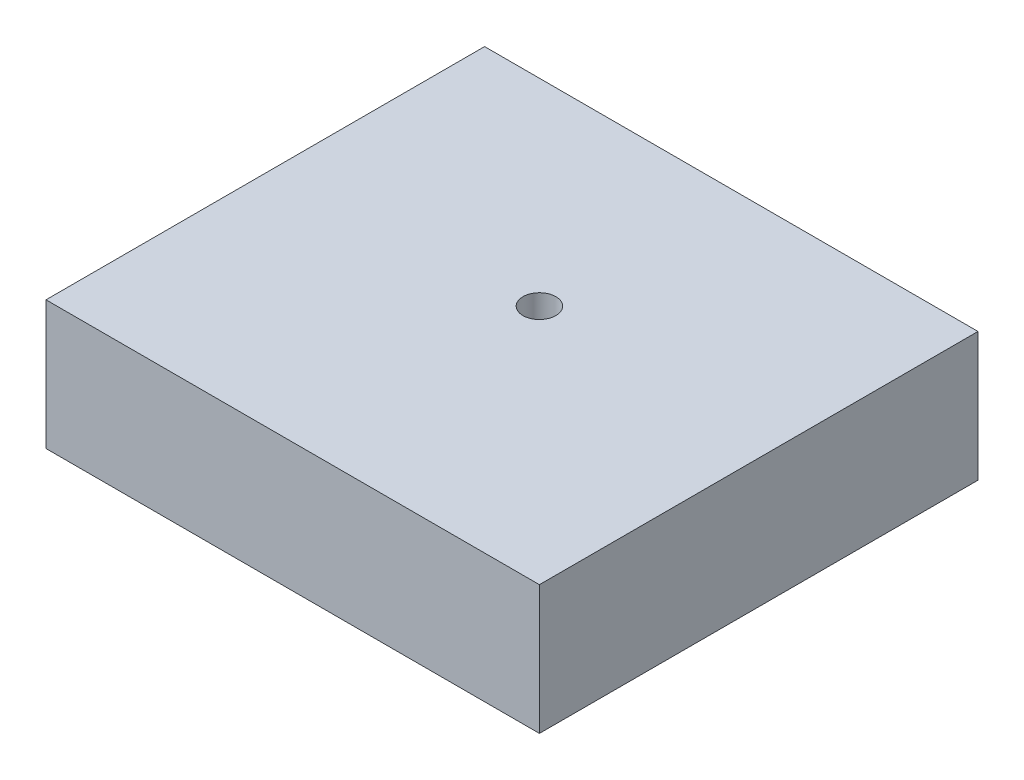
ISO-10303-21;
HEADER;
FILE_DESCRIPTION(('STEP AP214'),'2;1');
FILE_NAME('part.step','',(''),(''),'','','');
FILE_SCHEMA(('AUTOMOTIVE_DESIGN { 1 0 10303 214 1 1 1 1 }'));
ENDSEC;
DATA;
#1=APPLICATION_CONTEXT('core data for automotive mechanical design processes');
#2=APPLICATION_PROTOCOL_DEFINITION('international standard','automotive_design',2000,#1);
#3=PRODUCT_CONTEXT('',#1,'mechanical');
#4=PRODUCT('Part','Part','',(#3));
#5=PRODUCT_RELATED_PRODUCT_CATEGORY('part','',(#4));
#6=PRODUCT_DEFINITION_FORMATION('','',#4);
#7=PRODUCT_DEFINITION_CONTEXT('part definition',#1,'design');
#8=PRODUCT_DEFINITION('design','',#6,#7);
#9=PRODUCT_DEFINITION_SHAPE('','',#8);
#10=(LENGTH_UNIT() NAMED_UNIT(*) SI_UNIT(.MILLI.,.METRE.));
#11=(NAMED_UNIT(*) PLANE_ANGLE_UNIT() SI_UNIT($,.RADIAN.));
#12=(NAMED_UNIT(*) SI_UNIT($,.STERADIAN.) SOLID_ANGLE_UNIT());
#13=UNCERTAINTY_MEASURE_WITH_UNIT(LENGTH_MEASURE(1.E-05),#10,'distance_accuracy_value','');
#14=(GEOMETRIC_REPRESENTATION_CONTEXT(3) GLOBAL_UNCERTAINTY_ASSIGNED_CONTEXT((#13)) GLOBAL_UNIT_ASSIGNED_CONTEXT((#10,
#11,#12)) REPRESENTATION_CONTEXT('',''));
#15=CARTESIAN_POINT('',(0.,0.,0.));
#16=DIRECTION('',(0.,0.,1.));
#17=DIRECTION('',(1.,0.,0.));
#18=AXIS2_PLACEMENT_3D('',#15,#16,#17);
#19=CARTESIAN_POINT('',(0.,4.7,0.));
#20=DIRECTION('',(0.,-1.,0.));
#21=DIRECTION('',(0.,0.,-1.));
#22=AXIS2_PLACEMENT_3D('',#19,#20,#21);
#23=PLANE('',#22);
#24=DIRECTION('',(0.,0.,1.));
#25=VECTOR('',#24,1.);
#26=CARTESIAN_POINT('',(0.,4.7,0.));
#27=LINE('',#26,#25);
#28=CARTESIAN_POINT('',(0.,4.7,-16.));
#29=VERTEX_POINT('',#28);
#30=CARTESIAN_POINT('',(0.,4.7,0.));
#31=VERTEX_POINT('',#30);
#32=EDGE_CURVE('E85',#29,#31,#27,.T.);
#33=ORIENTED_EDGE('',*,*,#32,.T.);
#34=DIRECTION('',(1.,0.,0.));
#35=VECTOR('',#34,1.);
#36=CARTESIAN_POINT('',(0.,4.7,0.));
#37=LINE('',#36,#35);
#38=CARTESIAN_POINT('',(18.,4.7,0.));
#39=VERTEX_POINT('',#38);
#40=EDGE_CURVE('E80',#31,#39,#37,.T.);
#41=ORIENTED_EDGE('',*,*,#40,.T.);
#42=DIRECTION('',(0.,0.,-1.));
#43=VECTOR('',#42,1.);
#44=CARTESIAN_POINT('',(18.,4.7,0.));
#45=LINE('',#44,#43);
#46=CARTESIAN_POINT('',(18.,4.7,-16.));
#47=VERTEX_POINT('',#46);
#48=EDGE_CURVE('E83',#39,#47,#45,.T.);
#49=ORIENTED_EDGE('',*,*,#48,.T.);
#50=DIRECTION('',(-1.,0.,0.));
#51=VECTOR('',#50,1.);
#52=CARTESIAN_POINT('',(0.,4.7,-16.));
#53=LINE('',#52,#51);
#54=EDGE_CURVE('E50',#47,#29,#53,.T.);
#55=ORIENTED_EDGE('',*,*,#54,.T.);
#56=EDGE_LOOP('',(#33,#41,#49,#55));
#57=FACE_BOUND('',#56,.T.);
#58=CARTESIAN_POINT('',(9.2,4.7,-8.8));
#59=DIRECTION('',(0.,1.,0.));
#60=DIRECTION('',(0.,0.,1.));
#61=AXIS2_PLACEMENT_3D('',#58,#59,#60);
#62=CIRCLE('',#61,0.6);
#63=CARTESIAN_POINT('',(9.2,4.7,-8.2));
#64=VERTEX_POINT('',#63);
#65=EDGE_CURVE('E100',#64,#64,#62,.T.);
#66=ORIENTED_EDGE('',*,*,#65,.F.);
#67=EDGE_LOOP('',(#66));
#68=FACE_BOUND('',#67,.T.);
#69=ADVANCED_FACE('F33',(#57,#68),#23,.F.);
#70=CARTESIAN_POINT('',(0.,0.,0.));
#71=DIRECTION('',(0.,-1.,0.));
#72=DIRECTION('',(0.,0.,-1.));
#73=AXIS2_PLACEMENT_3D('',#70,#71,#72);
#74=PLANE('',#73);
#75=DIRECTION('',(0.,0.,1.));
#76=VECTOR('',#75,1.);
#77=CARTESIAN_POINT('',(0.,0.,0.));
#78=LINE('',#77,#76);
#79=CARTESIAN_POINT('',(0.,0.,-16.));
#80=VERTEX_POINT('',#79);
#81=CARTESIAN_POINT('',(0.,0.,0.));
#82=VERTEX_POINT('',#81);
#83=EDGE_CURVE('E97',#80,#82,#78,.T.);
#84=ORIENTED_EDGE('',*,*,#83,.F.);
#85=DIRECTION('',(-1.,0.,0.));
#86=VECTOR('',#85,1.);
#87=CARTESIAN_POINT('',(0.,0.,-16.));
#88=LINE('',#87,#86);
#89=CARTESIAN_POINT('',(18.,0.,-16.));
#90=VERTEX_POINT('',#89);
#91=EDGE_CURVE('E73',#90,#80,#88,.T.);
#92=ORIENTED_EDGE('',*,*,#91,.F.);
#93=DIRECTION('',(0.,0.,-1.));
#94=VECTOR('',#93,1.);
#95=CARTESIAN_POINT('',(18.,0.,0.));
#96=LINE('',#95,#94);
#97=CARTESIAN_POINT('',(18.,0.,0.));
#98=VERTEX_POINT('',#97);
#99=EDGE_CURVE('E67',#98,#90,#96,.T.);
#100=ORIENTED_EDGE('',*,*,#99,.F.);
#101=DIRECTION('',(1.,0.,0.));
#102=VECTOR('',#101,1.);
#103=CARTESIAN_POINT('',(0.,0.,0.));
#104=LINE('',#103,#102);
#105=EDGE_CURVE('E89',#82,#98,#104,.T.);
#106=ORIENTED_EDGE('',*,*,#105,.F.);
#107=EDGE_LOOP('',(#84,#92,#100,#106));
#108=FACE_BOUND('',#107,.T.);
#109=CARTESIAN_POINT('',(9.2,0.,-8.8));
#110=DIRECTION('',(0.,1.,0.));
#111=DIRECTION('',(0.,0.,1.));
#112=AXIS2_PLACEMENT_3D('',#109,#110,#111);
#113=CIRCLE('',#112,0.6);
#114=CARTESIAN_POINT('',(9.2,0.,-8.2));
#115=VERTEX_POINT('',#114);
#116=EDGE_CURVE('E112',#115,#115,#113,.T.);
#117=ORIENTED_EDGE('',*,*,#116,.T.);
#118=EDGE_LOOP('',(#117));
#119=FACE_BOUND('',#118,.T.);
#120=ADVANCED_FACE('F108',(#108,#119),#74,.T.);
#121=CARTESIAN_POINT('',(0.,4.7,0.));
#122=DIRECTION('',(1.,0.,0.));
#123=DIRECTION('',(0.,0.,-1.));
#124=AXIS2_PLACEMENT_3D('',#121,#122,#123);
#125=PLANE('',#124);
#126=ORIENTED_EDGE('',*,*,#83,.T.);
#127=DIRECTION('',(0.,-1.,0.));
#128=VECTOR('',#127,1.);
#129=CARTESIAN_POINT('',(0.,4.7,0.));
#130=LINE('',#129,#128);
#131=EDGE_CURVE('E11',#31,#82,#130,.T.);
#132=ORIENTED_EDGE('',*,*,#131,.F.);
#133=ORIENTED_EDGE('',*,*,#32,.F.);
#134=DIRECTION('',(0.,-1.,0.));
#135=VECTOR('',#134,1.);
#136=CARTESIAN_POINT('',(0.,4.7,-16.));
#137=LINE('',#136,#135);
#138=EDGE_CURVE('E93',#29,#80,#137,.T.);
#139=ORIENTED_EDGE('',*,*,#138,.T.);
#140=EDGE_LOOP('',(#126,#132,#133,#139));
#141=FACE_BOUND('',#140,.T.);
#142=ADVANCED_FACE('F35',(#141),#125,.F.);
#143=CARTESIAN_POINT('',(0.,4.7,0.));
#144=DIRECTION('',(0.,0.,-1.));
#145=DIRECTION('',(-1.,0.,0.));
#146=AXIS2_PLACEMENT_3D('',#143,#144,#145);
#147=PLANE('',#146);
#148=ORIENTED_EDGE('',*,*,#105,.T.);
#149=DIRECTION('',(0.,-1.,0.));
#150=VECTOR('',#149,1.);
#151=CARTESIAN_POINT('',(18.,4.7,0.));
#152=LINE('',#151,#150);
#153=EDGE_CURVE('E42',#39,#98,#152,.T.);
#154=ORIENTED_EDGE('',*,*,#153,.F.);
#155=ORIENTED_EDGE('',*,*,#40,.F.);
#156=ORIENTED_EDGE('',*,*,#131,.T.);
#157=EDGE_LOOP('',(#148,#154,#155,#156));
#158=FACE_BOUND('',#157,.T.);
#159=ADVANCED_FACE('F88',(#158),#147,.F.);
#160=CARTESIAN_POINT('',(18.,4.7,0.));
#161=DIRECTION('',(-1.,0.,0.));
#162=DIRECTION('',(0.,0.,1.));
#163=AXIS2_PLACEMENT_3D('',#160,#161,#162);
#164=PLANE('',#163);
#165=ORIENTED_EDGE('',*,*,#99,.T.);
#166=DIRECTION('',(0.,-1.,0.));
#167=VECTOR('',#166,1.);
#168=CARTESIAN_POINT('',(18.,4.7,-16.));
#169=LINE('',#168,#167);
#170=EDGE_CURVE('E90',#47,#90,#169,.T.);
#171=ORIENTED_EDGE('',*,*,#170,.F.);
#172=ORIENTED_EDGE('',*,*,#48,.F.);
#173=ORIENTED_EDGE('',*,*,#153,.T.);
#174=EDGE_LOOP('',(#165,#171,#172,#173));
#175=FACE_BOUND('',#174,.T.);
#176=ADVANCED_FACE('F91',(#175),#164,.F.);
#177=CARTESIAN_POINT('',(0.,4.7,-16.));
#178=DIRECTION('',(0.,0.,1.));
#179=DIRECTION('',(1.,0.,0.));
#180=AXIS2_PLACEMENT_3D('',#177,#178,#179);
#181=PLANE('',#180);
#182=ORIENTED_EDGE('',*,*,#91,.T.);
#183=ORIENTED_EDGE('',*,*,#138,.F.);
#184=ORIENTED_EDGE('',*,*,#54,.F.);
#185=ORIENTED_EDGE('',*,*,#170,.T.);
#186=EDGE_LOOP('',(#182,#183,#184,#185));
#187=FACE_BOUND('',#186,.T.);
#188=ADVANCED_FACE('F105',(#187),#181,.F.);
#189=CARTESIAN_POINT('',(9.2,4.7,-8.8));
#190=DIRECTION('',(0.,-1.,0.));
#191=DIRECTION('',(0.,0.,-1.));
#192=AXIS2_PLACEMENT_3D('',#189,#190,#191);
#193=CYLINDRICAL_SURFACE('',#192,0.6);
#194=ORIENTED_EDGE('',*,*,#65,.T.);
#195=EDGE_LOOP('',(#194));
#196=FACE_BOUND('',#195,.T.);
#197=ORIENTED_EDGE('',*,*,#116,.F.);
#198=EDGE_LOOP('',(#197));
#199=FACE_BOUND('',#198,.T.);
#200=ADVANCED_FACE('F118',(#196,#199),#193,.F.);
#201=CLOSED_SHELL('',(#69,#120,#142,#159,#176,#188,#200));
#202=MANIFOLD_SOLID_BREP('B2',#201);
#203=ADVANCED_BREP_SHAPE_REPRESENTATION('',(#18,#202),#14);
#204=SHAPE_DEFINITION_REPRESENTATION(#9,#203);
ENDSEC;
END-ISO-10303-21;
